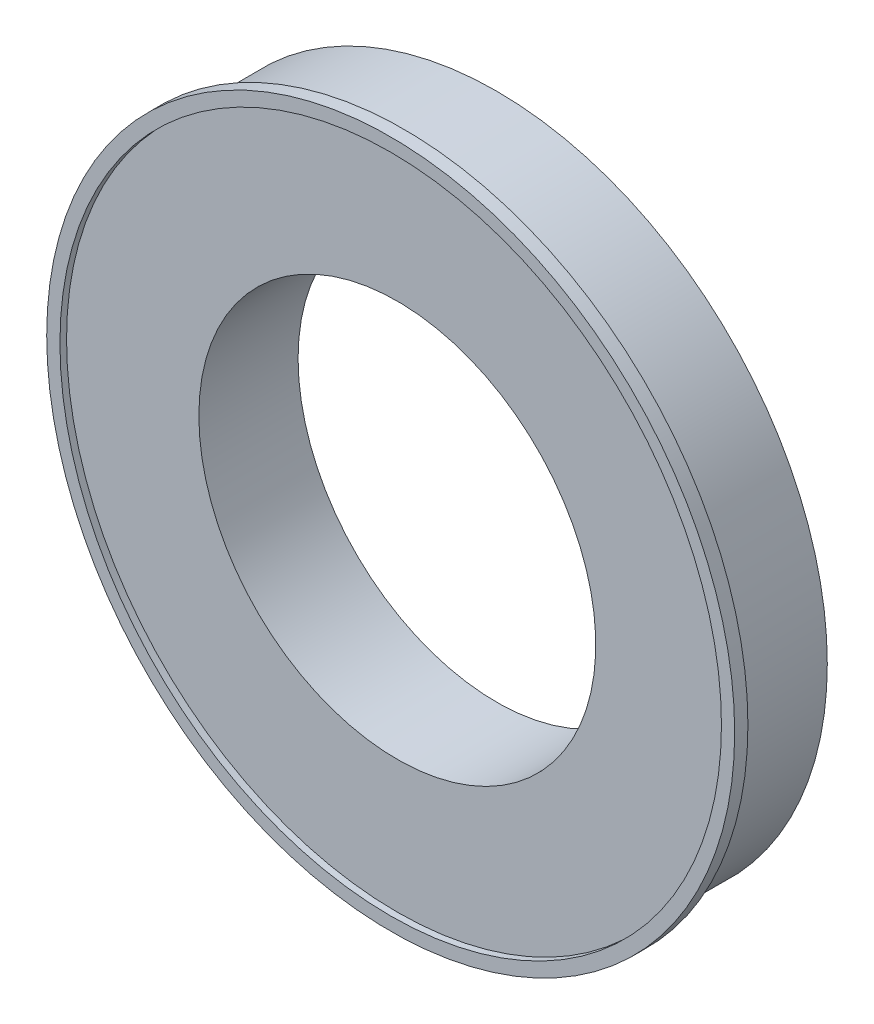
ISO-10303-21;
HEADER;
FILE_DESCRIPTION(('STEP AP214'),'2;1');
FILE_NAME('part.step','',(''),(''),'','','');
FILE_SCHEMA(('AUTOMOTIVE_DESIGN { 1 0 10303 214 1 1 1 1 }'));
ENDSEC;
DATA;
#1=APPLICATION_CONTEXT('core data for automotive mechanical design processes');
#2=APPLICATION_PROTOCOL_DEFINITION('international standard','automotive_design',2000,#1);
#3=PRODUCT_CONTEXT('',#1,'mechanical');
#4=PRODUCT('Part','Part','',(#3));
#5=PRODUCT_RELATED_PRODUCT_CATEGORY('part','',(#4));
#6=PRODUCT_DEFINITION_FORMATION('','',#4);
#7=PRODUCT_DEFINITION_CONTEXT('part definition',#1,'design');
#8=PRODUCT_DEFINITION('design','',#6,#7);
#9=PRODUCT_DEFINITION_SHAPE('','',#8);
#10=(LENGTH_UNIT() NAMED_UNIT(*) SI_UNIT(.MILLI.,.METRE.));
#11=(NAMED_UNIT(*) PLANE_ANGLE_UNIT() SI_UNIT($,.RADIAN.));
#12=(NAMED_UNIT(*) SI_UNIT($,.STERADIAN.) SOLID_ANGLE_UNIT());
#13=UNCERTAINTY_MEASURE_WITH_UNIT(LENGTH_MEASURE(1.E-05),#10,'distance_accuracy_value','');
#14=(GEOMETRIC_REPRESENTATION_CONTEXT(3) GLOBAL_UNCERTAINTY_ASSIGNED_CONTEXT((#13)) GLOBAL_UNIT_ASSIGNED_CONTEXT((#10,
#11,#12)) REPRESENTATION_CONTEXT('',''));
#15=CARTESIAN_POINT('',(0.,0.,0.));
#16=DIRECTION('',(0.,0.,1.));
#17=DIRECTION('',(1.,0.,0.));
#18=AXIS2_PLACEMENT_3D('',#15,#16,#17);
#19=CARTESIAN_POINT('',(0.,0.,9.525));
#20=DIRECTION('',(0.,0.,-1.));
#21=DIRECTION('',(-1.,0.,0.));
#22=AXIS2_PLACEMENT_3D('',#19,#20,#21);
#23=CYLINDRICAL_SURFACE('',#22,63.5);
#24=CARTESIAN_POINT('',(0.,0.,-9.525));
#25=DIRECTION('',(0.,0.,1.));
#26=DIRECTION('',(1.,0.,0.));
#27=AXIS2_PLACEMENT_3D('',#24,#25,#26);
#28=CIRCLE('',#27,63.5);
#29=CARTESIAN_POINT('',(-63.5,0.,-9.525));
#30=VERTEX_POINT('',#29);
#31=EDGE_CURVE('E50',#30,#30,#28,.T.);
#32=CARTESIAN_POINT('',(0.,0.,8.255));
#33=DIRECTION('',(0.,0.,1.));
#34=DIRECTION('',(1.,0.,0.));
#35=AXIS2_PLACEMENT_3D('',#32,#33,#34);
#36=CIRCLE('',#35,63.5);
#37=CARTESIAN_POINT('',(-63.5,0.,8.255));
#38=VERTEX_POINT('',#37);
#39=EDGE_CURVE('E10',#38,#38,#36,.T.);
#40=CARTESIAN_POINT('',(-63.5,0.,-9.525));
#41=CARTESIAN_POINT('',(-63.5,0.,-9.33979166666667));
#42=CARTESIAN_POINT('',(-63.5,0.,-9.15458333333333));
#43=CARTESIAN_POINT('',(-63.5,0.,-8.78416666666667));
#44=CARTESIAN_POINT('',(-63.5,0.,-8.59895833333333));
#45=CARTESIAN_POINT('',(-63.5,0.,-8.22854166666666));
#46=CARTESIAN_POINT('',(-63.5,0.,-8.04333333333333));
#47=CARTESIAN_POINT('',(-63.5,0.,-7.67291666666667));
#48=CARTESIAN_POINT('',(-63.5,0.,-7.48770833333333));
#49=CARTESIAN_POINT('',(-63.5,0.,-7.11729166666667));
#50=CARTESIAN_POINT('',(-63.5,0.,-6.93208333333333));
#51=CARTESIAN_POINT('',(-63.5,0.,-6.56166666666667));
#52=CARTESIAN_POINT('',(-63.5,0.,-6.37645833333333));
#53=CARTESIAN_POINT('',(-63.5,0.,-6.00604166666667));
#54=CARTESIAN_POINT('',(-63.5,0.,-5.82083333333333));
#55=CARTESIAN_POINT('',(-63.5,0.,-5.45041666666667));
#56=CARTESIAN_POINT('',(-63.5,0.,-5.26520833333333));
#57=CARTESIAN_POINT('',(-63.5,0.,-4.89479166666667));
#58=CARTESIAN_POINT('',(-63.5,0.,-4.70958333333333));
#59=CARTESIAN_POINT('',(-63.5,0.,-4.33916666666667));
#60=CARTESIAN_POINT('',(-63.5,0.,-4.15395833333333));
#61=CARTESIAN_POINT('',(-63.5,0.,-3.78354166666667));
#62=CARTESIAN_POINT('',(-63.5,0.,-3.59833333333333));
#63=CARTESIAN_POINT('',(-63.5,0.,-3.22791666666667));
#64=CARTESIAN_POINT('',(-63.5,0.,-3.04270833333333));
#65=CARTESIAN_POINT('',(-63.5,0.,-2.67229166666667));
#66=CARTESIAN_POINT('',(-63.5,0.,-2.48708333333333));
#67=CARTESIAN_POINT('',(-63.5,0.,-2.11666666666667));
#68=CARTESIAN_POINT('',(-63.5,0.,-1.93145833333333));
#69=CARTESIAN_POINT('',(-63.5,0.,-1.56104166666667));
#70=CARTESIAN_POINT('',(-63.5,0.,-1.37583333333333));
#71=CARTESIAN_POINT('',(-63.5,0.,-1.00541666666667));
#72=CARTESIAN_POINT('',(-63.5,0.,-0.820208333333334));
#73=CARTESIAN_POINT('',(-63.5,0.,-0.449791666666667));
#74=CARTESIAN_POINT('',(-63.5,0.,-0.264583333333333));
#75=CARTESIAN_POINT('',(-63.5,0.,0.105833333333334));
#76=CARTESIAN_POINT('',(-63.5,0.,0.291041666666667));
#77=CARTESIAN_POINT('',(-63.5,0.,0.661458333333334));
#78=CARTESIAN_POINT('',(-63.5,0.,0.846666666666667));
#79=CARTESIAN_POINT('',(-63.5,0.,1.21708333333333));
#80=CARTESIAN_POINT('',(-63.5,0.,1.40229166666667));
#81=CARTESIAN_POINT('',(-63.5,0.,1.77270833333333));
#82=CARTESIAN_POINT('',(-63.5,0.,1.95791666666667));
#83=CARTESIAN_POINT('',(-63.5,0.,2.32833333333333));
#84=CARTESIAN_POINT('',(-63.5,0.,2.51354166666667));
#85=CARTESIAN_POINT('',(-63.5,0.,2.88395833333333));
#86=CARTESIAN_POINT('',(-63.5,0.,3.06916666666667));
#87=CARTESIAN_POINT('',(-63.5,0.,3.43958333333333));
#88=CARTESIAN_POINT('',(-63.5,0.,3.62479166666667));
#89=CARTESIAN_POINT('',(-63.5,0.,3.99520833333333));
#90=CARTESIAN_POINT('',(-63.5,0.,4.18041666666667));
#91=CARTESIAN_POINT('',(-63.5,0.,4.55083333333333));
#92=CARTESIAN_POINT('',(-63.5,0.,4.73604166666667));
#93=CARTESIAN_POINT('',(-63.5,0.,5.10645833333333));
#94=CARTESIAN_POINT('',(-63.5,0.,5.29166666666667));
#95=CARTESIAN_POINT('',(-63.5,0.,5.66208333333333));
#96=CARTESIAN_POINT('',(-63.5,0.,5.84729166666667));
#97=CARTESIAN_POINT('',(-63.5,0.,6.21770833333333));
#98=CARTESIAN_POINT('',(-63.5,0.,6.40291666666667));
#99=CARTESIAN_POINT('',(-63.5,0.,6.77333333333333));
#100=CARTESIAN_POINT('',(-63.5,0.,6.95854166666667));
#101=CARTESIAN_POINT('',(-63.5,0.,7.32895833333333));
#102=CARTESIAN_POINT('',(-63.5,0.,7.51416666666667));
#103=CARTESIAN_POINT('',(-63.5,0.,7.88458333333333));
#104=CARTESIAN_POINT('',(-63.5,0.,8.06979166666667));
#105=CARTESIAN_POINT('',(-63.5,0.,8.255));
#106=B_SPLINE_CURVE_WITH_KNOTS('',3,(#40,#41,#42,#43,#44,#45,#46,#47,#48,#49,#50,#51,#52,#53,
#54,#55,#56,#57,#58,#59,#60,#61,#62,#63,#64,#65,#66,#67,#68,#69,#70,#71,#72,#73,#74,#75,#76,#77,
#78,#79,#80,#81,#82,#83,#84,#85,#86,#87,#88,#89,#90,#91,#92,#93,#94,#95,#96,#97,#98,#99,#100,
#101,#102,#103,#104,#105),.UNSPECIFIED.,.F.,.F.,(4,2,2,2,2,2,2,2,2,2,2,2,2,2,2,2,2,2,2,2,2,2,2,
2,2,2,2,2,2,2,2,2,4),(0.,0.555625000000001,1.11125,1.666875,2.2225,2.778125,3.33375,3.889375,
4.445,5.000625,5.55625,6.111875,6.6675,7.223125,7.77875,8.334375,8.89,9.445625,10.00125,
10.556875,11.1125,11.668125,12.22375,12.779375,13.335,13.890625,14.44625,15.001875,15.5575,
16.113125,16.66875,17.224375,17.78),.UNSPECIFIED.);
#107=EDGE_CURVE('BSEAM43',#30,#38,#106,.T.);
#108=ORIENTED_EDGE('',*,*,#31,.T.);
#109=ORIENTED_EDGE('',*,*,#39,.F.);
#110=ORIENTED_EDGE('',*,*,#107,.T.);
#111=ORIENTED_EDGE('',*,*,#107,.F.);
#112=EDGE_LOOP('',(#108,#110,#109,#111));
#113=FACE_BOUND('',#112,.T.);
#114=ADVANCED_FACE('F43',(#113),#23,.T.);
#115=CARTESIAN_POINT('',(0.,0.,9.525));
#116=DIRECTION('',(0.,0.,1.));
#117=DIRECTION('',(1.,0.,0.));
#118=AXIS2_PLACEMENT_3D('',#115,#116,#117);
#119=PLANE('',#118);
#120=CARTESIAN_POINT('',(0.,0.,9.525));
#121=DIRECTION('',(0.,0.,1.));
#122=DIRECTION('',(1.,0.,0.));
#123=AXIS2_PLACEMENT_3D('',#120,#121,#122);
#124=CIRCLE('',#123,63.5);
#125=CARTESIAN_POINT('',(63.5,0.,9.525));
#126=VERTEX_POINT('',#125);
#127=EDGE_CURVE('E65',#126,#126,#124,.F.);
#128=ORIENTED_EDGE('',*,*,#127,.F.);
#129=EDGE_LOOP('',(#128));
#130=FACE_BOUND('',#129,.T.);
#131=CARTESIAN_POINT('',(0.,0.,9.525));
#132=DIRECTION('',(0.,0.,1.));
#133=DIRECTION('',(1.,0.,0.));
#134=AXIS2_PLACEMENT_3D('',#131,#132,#133);
#135=CIRCLE('',#134,38.1);
#136=CARTESIAN_POINT('',(-38.1,0.,9.525));
#137=VERTEX_POINT('',#136);
#138=EDGE_CURVE('E55',#137,#137,#135,.T.);
#139=ORIENTED_EDGE('',*,*,#138,.F.);
#140=EDGE_LOOP('',(#139));
#141=FACE_BOUND('',#140,.T.);
#142=ADVANCED_FACE('F103',(#130,#141),#119,.T.);
#143=CARTESIAN_POINT('',(0.,0.,-9.525));
#144=DIRECTION('',(0.,0.,1.));
#145=DIRECTION('',(1.,0.,0.));
#146=AXIS2_PLACEMENT_3D('',#143,#144,#145);
#147=PLANE('',#146);
#148=ORIENTED_EDGE('',*,*,#31,.F.);
#149=EDGE_LOOP('',(#148));
#150=FACE_BOUND('',#149,.T.);
#151=CARTESIAN_POINT('',(0.,0.,-9.525));
#152=DIRECTION('',(0.,0.,1.));
#153=DIRECTION('',(1.,0.,0.));
#154=AXIS2_PLACEMENT_3D('',#151,#152,#153);
#155=CIRCLE('',#154,38.1);
#156=CARTESIAN_POINT('',(-38.1,0.,-9.525));
#157=VERTEX_POINT('',#156);
#158=EDGE_CURVE('E60',#157,#157,#155,.T.);
#159=ORIENTED_EDGE('',*,*,#158,.T.);
#160=EDGE_LOOP('',(#159));
#161=FACE_BOUND('',#160,.T.);
#162=ADVANCED_FACE('F99',(#150,#161),#147,.F.);
#163=CARTESIAN_POINT('',(0.,0.,9.525));
#164=DIRECTION('',(0.,0.,-1.));
#165=DIRECTION('',(-1.,0.,0.));
#166=AXIS2_PLACEMENT_3D('',#163,#164,#165);
#167=CYLINDRICAL_SURFACE('',#166,38.1);
#168=CARTESIAN_POINT('',(-38.1,0.,9.525));
#169=CARTESIAN_POINT('',(-38.1,0.,9.3265625));
#170=CARTESIAN_POINT('',(-38.1,0.,9.128125));
#171=CARTESIAN_POINT('',(-38.1,0.,8.73125));
#172=CARTESIAN_POINT('',(-38.1,0.,8.5328125));
#173=CARTESIAN_POINT('',(-38.1,0.,8.1359375));
#174=CARTESIAN_POINT('',(-38.1,0.,7.9375));
#175=CARTESIAN_POINT('',(-38.1,0.,7.540625));
#176=CARTESIAN_POINT('',(-38.1,0.,7.3421875));
#177=CARTESIAN_POINT('',(-38.1,0.,6.9453125));
#178=CARTESIAN_POINT('',(-38.1,0.,6.746875));
#179=CARTESIAN_POINT('',(-38.1,0.,6.35));
#180=CARTESIAN_POINT('',(-38.1,0.,6.1515625));
#181=CARTESIAN_POINT('',(-38.1,0.,5.7546875));
#182=CARTESIAN_POINT('',(-38.1,0.,5.55625));
#183=CARTESIAN_POINT('',(-38.1,0.,5.159375));
#184=CARTESIAN_POINT('',(-38.1,0.,4.9609375));
#185=CARTESIAN_POINT('',(-38.1,0.,4.5640625));
#186=CARTESIAN_POINT('',(-38.1,0.,4.365625));
#187=CARTESIAN_POINT('',(-38.1,0.,3.96875));
#188=CARTESIAN_POINT('',(-38.1,0.,3.7703125));
#189=CARTESIAN_POINT('',(-38.1,0.,3.3734375));
#190=CARTESIAN_POINT('',(-38.1,0.,3.175));
#191=CARTESIAN_POINT('',(-38.1,0.,2.778125));
#192=CARTESIAN_POINT('',(-38.1,0.,2.5796875));
#193=CARTESIAN_POINT('',(-38.1,0.,2.1828125));
#194=CARTESIAN_POINT('',(-38.1,0.,1.984375));
#195=CARTESIAN_POINT('',(-38.1,0.,1.5875));
#196=CARTESIAN_POINT('',(-38.1,0.,1.3890625));
#197=CARTESIAN_POINT('',(-38.1,0.,0.992187499999999));
#198=CARTESIAN_POINT('',(-38.1,0.,0.793749999999999));
#199=CARTESIAN_POINT('',(-38.1,0.,0.396874999999998));
#200=CARTESIAN_POINT('',(-38.1,0.,0.198437499999998));
#201=CARTESIAN_POINT('',(-38.1,0.,-0.198437500000002));
#202=CARTESIAN_POINT('',(-38.1,0.,-0.396875000000002));
#203=CARTESIAN_POINT('',(-38.1,0.,-0.793750000000002));
#204=CARTESIAN_POINT('',(-38.1,0.,-0.992187500000002));
#205=CARTESIAN_POINT('',(-38.1,0.,-1.3890625));
#206=CARTESIAN_POINT('',(-38.1,0.,-1.5875));
#207=CARTESIAN_POINT('',(-38.1,0.,-1.984375));
#208=CARTESIAN_POINT('',(-38.1,0.,-2.1828125));
#209=CARTESIAN_POINT('',(-38.1,0.,-2.5796875));
#210=CARTESIAN_POINT('',(-38.1,0.,-2.778125));
#211=CARTESIAN_POINT('',(-38.1,0.,-3.175));
#212=CARTESIAN_POINT('',(-38.1,0.,-3.3734375));
#213=CARTESIAN_POINT('',(-38.1,0.,-3.7703125));
#214=CARTESIAN_POINT('',(-38.1,0.,-3.96875));
#215=CARTESIAN_POINT('',(-38.1,0.,-4.365625));
#216=CARTESIAN_POINT('',(-38.1,0.,-4.5640625));
#217=CARTESIAN_POINT('',(-38.1,0.,-4.9609375));
#218=CARTESIAN_POINT('',(-38.1,0.,-5.159375));
#219=CARTESIAN_POINT('',(-38.1,0.,-5.55625));
#220=CARTESIAN_POINT('',(-38.1,0.,-5.7546875));
#221=CARTESIAN_POINT('',(-38.1,0.,-6.1515625));
#222=CARTESIAN_POINT('',(-38.1,0.,-6.35));
#223=CARTESIAN_POINT('',(-38.1,0.,-6.746875));
#224=CARTESIAN_POINT('',(-38.1,0.,-6.9453125));
#225=CARTESIAN_POINT('',(-38.1,0.,-7.3421875));
#226=CARTESIAN_POINT('',(-38.1,0.,-7.540625));
#227=CARTESIAN_POINT('',(-38.1,0.,-7.9375));
#228=CARTESIAN_POINT('',(-38.1,0.,-8.1359375));
#229=CARTESIAN_POINT('',(-38.1,0.,-8.5328125));
#230=CARTESIAN_POINT('',(-38.1,0.,-8.73125));
#231=CARTESIAN_POINT('',(-38.1,0.,-9.128125));
#232=CARTESIAN_POINT('',(-38.1,0.,-9.3265625));
#233=CARTESIAN_POINT('',(-38.1,0.,-9.525));
#234=B_SPLINE_CURVE_WITH_KNOTS('',3,(#168,#169,#170,#171,#172,#173,#174,#175,#176,#177,#178,
#179,#180,#181,#182,#183,#184,#185,#186,#187,#188,#189,#190,#191,#192,#193,#194,#195,#196,#197,
#198,#199,#200,#201,#202,#203,#204,#205,#206,#207,#208,#209,#210,#211,#212,#213,#214,#215,#216,
#217,#218,#219,#220,#221,#222,#223,#224,#225,#226,#227,#228,#229,#230,#231,#232,#233),
.UNSPECIFIED.,.F.,.F.,(4,2,2,2,2,2,2,2,2,2,2,2,2,2,2,2,2,2,2,2,2,2,2,2,2,2,2,2,2,2,2,2,4),(0.,
0.595312499999999,1.190625,1.7859375,2.38125,2.9765625,3.571875,4.1671875,4.7625,5.3578125,
5.953125,6.5484375,7.14375,7.7390625,8.334375,8.9296875,9.525,10.1203125,10.715625,11.3109375,
11.90625,12.5015625,13.096875,13.6921875,14.2875,14.8828125,15.478125,16.0734375,16.66875,
17.2640625,17.859375,18.4546875,19.05),.UNSPECIFIED.);
#235=EDGE_CURVE('BSEAM88',#137,#157,#234,.T.);
#236=ORIENTED_EDGE('',*,*,#138,.T.);
#237=ORIENTED_EDGE('',*,*,#158,.F.);
#238=ORIENTED_EDGE('',*,*,#235,.T.);
#239=ORIENTED_EDGE('',*,*,#235,.F.);
#240=EDGE_LOOP('',(#236,#238,#237,#239));
#241=FACE_BOUND('',#240,.T.);
#242=ADVANCED_FACE('F88',(#241),#167,.F.);
#243=CARTESIAN_POINT('',(0.,0.,10.795));
#244=DIRECTION('',(0.,0.,1.));
#245=DIRECTION('',(1.,0.,0.));
#246=AXIS2_PLACEMENT_3D('',#243,#244,#245);
#247=PLANE('',#246);
#248=CARTESIAN_POINT('',(0.,0.,10.795));
#249=DIRECTION('',(0.,0.,1.));
#250=DIRECTION('',(1.,0.,0.));
#251=AXIS2_PLACEMENT_3D('',#248,#249,#250);
#252=CIRCLE('',#251,66.04);
#253=CARTESIAN_POINT('',(66.04,0.,10.795));
#254=VERTEX_POINT('',#253);
#255=EDGE_CURVE('E70',#254,#254,#252,.T.);
#256=ORIENTED_EDGE('',*,*,#255,.T.);
#257=EDGE_LOOP('',(#256));
#258=FACE_BOUND('',#257,.T.);
#259=CARTESIAN_POINT('',(0.,0.,10.795));
#260=DIRECTION('',(0.,0.,1.));
#261=DIRECTION('',(1.,0.,0.));
#262=AXIS2_PLACEMENT_3D('',#259,#260,#261);
#263=CIRCLE('',#262,63.5);
#264=CARTESIAN_POINT('',(63.5,0.,10.795));
#265=VERTEX_POINT('',#264);
#266=EDGE_CURVE('E75',#265,#265,#263,.T.);
#267=ORIENTED_EDGE('',*,*,#266,.F.);
#268=EDGE_LOOP('',(#267));
#269=FACE_BOUND('',#268,.T.);
#270=ADVANCED_FACE('F85',(#258,#269),#247,.T.);
#271=CARTESIAN_POINT('',(0.,0.,8.255));
#272=DIRECTION('',(0.,0.,1.));
#273=DIRECTION('',(1.,0.,0.));
#274=AXIS2_PLACEMENT_3D('',#271,#272,#273);
#275=PLANE('',#274);
#276=CARTESIAN_POINT('',(0.,0.,8.255));
#277=DIRECTION('',(0.,0.,1.));
#278=DIRECTION('',(1.,0.,0.));
#279=AXIS2_PLACEMENT_3D('',#276,#277,#278);
#280=CIRCLE('',#279,66.04);
#281=CARTESIAN_POINT('',(66.04,0.,8.255));
#282=VERTEX_POINT('',#281);
#283=EDGE_CURVE('E71',#282,#282,#280,.T.);
#284=ORIENTED_EDGE('',*,*,#283,.F.);
#285=EDGE_LOOP('',(#284));
#286=FACE_BOUND('',#285,.T.);
#287=ORIENTED_EDGE('',*,*,#39,.T.);
#288=EDGE_LOOP('',(#287));
#289=FACE_BOUND('',#288,.T.);
#290=ADVANCED_FACE('F87',(#286,#289),#275,.F.);
#291=CARTESIAN_POINT('',(0.,0.,10.795));
#292=DIRECTION('',(0.,0.,-1.));
#293=DIRECTION('',(-1.,0.,0.));
#294=AXIS2_PLACEMENT_3D('',#291,#292,#293);
#295=CYLINDRICAL_SURFACE('',#294,66.04);
#296=ORIENTED_EDGE('',*,*,#255,.F.);
#297=EDGE_LOOP('',(#296));
#298=FACE_BOUND('',#297,.T.);
#299=ORIENTED_EDGE('',*,*,#283,.T.);
#300=EDGE_LOOP('',(#299));
#301=FACE_BOUND('',#300,.T.);
#302=ADVANCED_FACE('F95',(#298,#301),#295,.T.);
#303=CARTESIAN_POINT('',(0.,0.,10.795));
#304=DIRECTION('',(0.,0.,-1.));
#305=DIRECTION('',(-1.,0.,0.));
#306=AXIS2_PLACEMENT_3D('',#303,#304,#305);
#307=CYLINDRICAL_SURFACE('',#306,63.5);
#308=ORIENTED_EDGE('',*,*,#127,.T.);
#309=EDGE_LOOP('',(#308));
#310=FACE_BOUND('',#309,.T.);
#311=ORIENTED_EDGE('',*,*,#266,.T.);
#312=EDGE_LOOP('',(#311));
#313=FACE_BOUND('',#312,.T.);
#314=ADVANCED_FACE('F83',(#310,#313),#307,.F.);
#315=CLOSED_SHELL('',(#114,#142,#162,#242,#270,#290,#302,#314));
#316=MANIFOLD_SOLID_BREP('B2',#315);
#317=ADVANCED_BREP_SHAPE_REPRESENTATION('',(#18,#316),#14);
#318=SHAPE_DEFINITION_REPRESENTATION(#9,#317);
ENDSEC;
END-ISO-10303-21;
